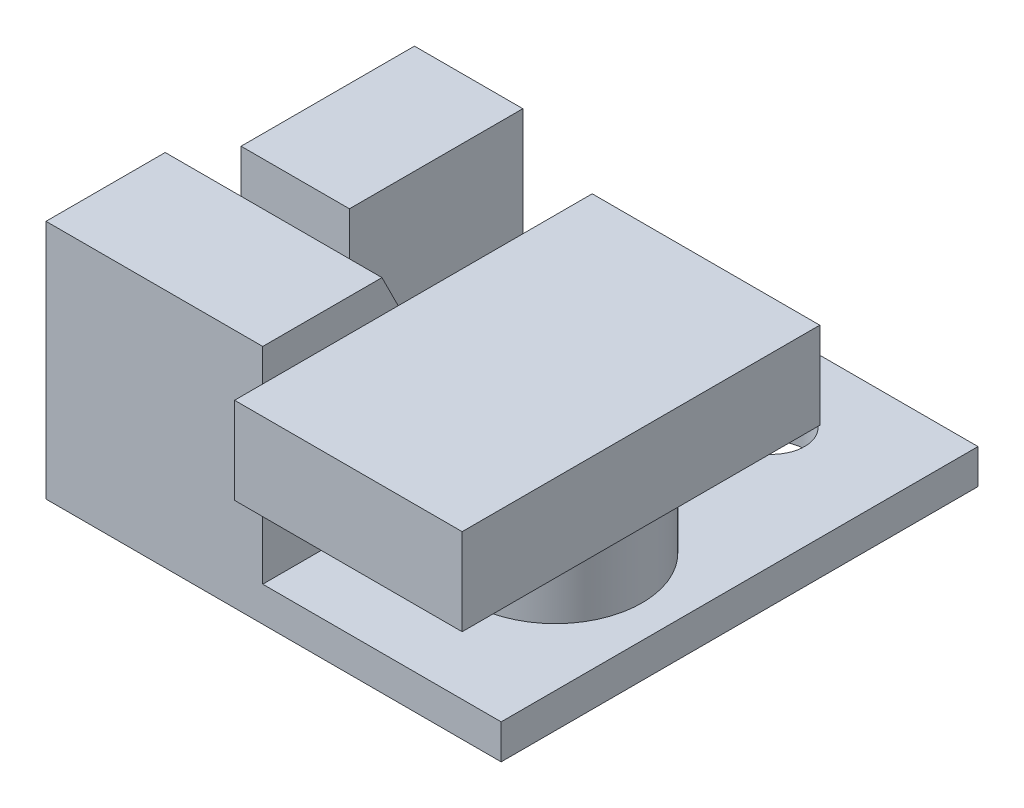
ISO-10303-21;
HEADER;
FILE_DESCRIPTION(('STEP AP214'),'2;1');
FILE_NAME('part.step','',(''),(''),'','','');
FILE_SCHEMA(('AUTOMOTIVE_DESIGN { 1 0 10303 214 1 1 1 1 }'));
ENDSEC;
DATA;
#1=APPLICATION_CONTEXT('core data for automotive mechanical design processes');
#2=APPLICATION_PROTOCOL_DEFINITION('international standard','automotive_design',2000,#1);
#3=PRODUCT_CONTEXT('',#1,'mechanical');
#4=PRODUCT('Part','Part','',(#3));
#5=PRODUCT_RELATED_PRODUCT_CATEGORY('part','',(#4));
#6=PRODUCT_DEFINITION_FORMATION('','',#4);
#7=PRODUCT_DEFINITION_CONTEXT('part definition',#1,'design');
#8=PRODUCT_DEFINITION('design','',#6,#7);
#9=PRODUCT_DEFINITION_SHAPE('','',#8);
#10=(LENGTH_UNIT() NAMED_UNIT(*) SI_UNIT(.MILLI.,.METRE.));
#11=(NAMED_UNIT(*) PLANE_ANGLE_UNIT() SI_UNIT($,.RADIAN.));
#12=(NAMED_UNIT(*) SI_UNIT($,.STERADIAN.) SOLID_ANGLE_UNIT());
#13=UNCERTAINTY_MEASURE_WITH_UNIT(LENGTH_MEASURE(1.E-05),#10,'distance_accuracy_value','');
#14=(GEOMETRIC_REPRESENTATION_CONTEXT(3) GLOBAL_UNCERTAINTY_ASSIGNED_CONTEXT((#13)) GLOBAL_UNIT_ASSIGNED_CONTEXT((#10,
#11,#12)) REPRESENTATION_CONTEXT('',''));
#15=CARTESIAN_POINT('',(0.,0.,0.));
#16=DIRECTION('',(0.,0.,1.));
#17=DIRECTION('',(1.,0.,0.));
#18=AXIS2_PLACEMENT_3D('',#15,#16,#17);
#19=CARTESIAN_POINT('',(0.,1.6,0.));
#20=DIRECTION('',(0.,1.,0.));
#21=DIRECTION('',(0.,0.,1.));
#22=AXIS2_PLACEMENT_3D('',#19,#20,#21);
#23=PLANE('',#22);
#24=DIRECTION('',(-1.,0.,0.));
#25=VECTOR('',#24,1.);
#26=CARTESIAN_POINT('',(-0.500000000000005,1.6,3.5));
#27=LINE('',#26,#25);
#28=CARTESIAN_POINT('',(-0.500000000000005,1.6,3.5));
#29=VERTEX_POINT('',#28);
#30=CARTESIAN_POINT('',(-10.5,1.6,3.5));
#31=VERTEX_POINT('',#30);
#32=EDGE_CURVE('E196',#29,#31,#27,.T.);
#33=ORIENTED_EDGE('',*,*,#32,.F.);
#34=DIRECTION('',(0.,0.,-1.));
#35=VECTOR('',#34,1.);
#36=CARTESIAN_POINT('',(-0.500000000000005,1.6,3.5));
#37=LINE('',#36,#35);
#38=CARTESIAN_POINT('',(-0.500000000000004,1.6,11.));
#39=VERTEX_POINT('',#38);
#40=EDGE_CURVE('E191',#39,#29,#37,.T.);
#41=ORIENTED_EDGE('',*,*,#40,.F.);
#42=DIRECTION('',(1.,0.,0.));
#43=VECTOR('',#42,1.);
#44=CARTESIAN_POINT('',(-10.5,1.6,11.));
#45=LINE('',#44,#43);
#46=CARTESIAN_POINT('',(10.5,1.6,11.));
#47=VERTEX_POINT('',#46);
#48=EDGE_CURVE('E274',#39,#47,#45,.T.);
#49=ORIENTED_EDGE('',*,*,#48,.T.);
#50=DIRECTION('',(0.,0.,-1.));
#51=VECTOR('',#50,1.);
#52=CARTESIAN_POINT('',(10.5,1.6,-11.));
#53=LINE('',#52,#51);
#54=CARTESIAN_POINT('',(10.5,1.6,-11.));
#55=VERTEX_POINT('',#54);
#56=EDGE_CURVE('E264',#47,#55,#53,.T.);
#57=ORIENTED_EDGE('',*,*,#56,.T.);
#58=DIRECTION('',(-1.,0.,0.));
#59=VECTOR('',#58,1.);
#60=CARTESIAN_POINT('',(-10.5,1.6,-11.));
#61=LINE('',#60,#59);
#62=CARTESIAN_POINT('',(1.5,1.6,-11.));
#63=VERTEX_POINT('',#62);
#64=EDGE_CURVE('E267',#55,#63,#61,.T.);
#65=ORIENTED_EDGE('',*,*,#64,.T.);
#66=DIRECTION('',(0.707106781186546,0.,-0.707106781186549));
#67=VECTOR('',#66,1.);
#68=CARTESIAN_POINT('',(-0.999999999999988,1.6,-8.5));
#69=LINE('',#68,#67);
#70=CARTESIAN_POINT('',(-0.999999999999988,1.6,-8.5));
#71=VERTEX_POINT('',#70);
#72=EDGE_CURVE('E252',#71,#63,#69,.T.);
#73=ORIENTED_EDGE('',*,*,#72,.F.);
#74=DIRECTION('',(1.,0.,0.));
#75=VECTOR('',#74,1.);
#76=CARTESIAN_POINT('',(-12.0780291909739,1.6,-8.5));
#77=LINE('',#76,#75);
#78=CARTESIAN_POINT('',(-10.5,1.6,-8.5));
#79=VERTEX_POINT('',#78);
#80=EDGE_CURVE('E245',#79,#71,#77,.T.);
#81=ORIENTED_EDGE('',*,*,#80,.F.);
#82=DIRECTION('',(0.,0.,1.));
#83=VECTOR('',#82,1.);
#84=CARTESIAN_POINT('',(-10.5,1.6,-11.));
#85=LINE('',#84,#83);
#86=EDGE_CURVE('E271',#79,#31,#85,.T.);
#87=ORIENTED_EDGE('',*,*,#86,.T.);
#88=EDGE_LOOP('',(#33,#41,#49,#57,#65,#73,#81,#87));
#89=FACE_BOUND('',#88,.T.);
#90=CARTESIAN_POINT('',(5.,1.6,-7.));
#91=DIRECTION('',(0.,1.,0.));
#92=DIRECTION('',(0.,0.,1.));
#93=AXIS2_PLACEMENT_3D('',#90,#91,#92);
#94=CIRCLE('',#93,1.5);
#95=CARTESIAN_POINT('',(5.,1.6,-5.5));
#96=VERTEX_POINT('',#95);
#97=EDGE_CURVE('E241',#96,#96,#94,.T.);
#98=ORIENTED_EDGE('',*,*,#97,.F.);
#99=EDGE_LOOP('',(#98));
#100=FACE_BOUND('',#99,.T.);
#101=DIRECTION('',(1.,0.,0.));
#102=VECTOR('',#101,1.);
#103=CARTESIAN_POINT('',(-5.,1.6,2.5));
#104=LINE('',#103,#102);
#105=CARTESIAN_POINT('',(-10.,1.6,2.5));
#106=VERTEX_POINT('',#105);
#107=CARTESIAN_POINT('',(-5.,1.6,2.5));
#108=VERTEX_POINT('',#107);
#109=EDGE_CURVE('E226',#106,#108,#104,.T.);
#110=ORIENTED_EDGE('',*,*,#109,.F.);
#111=DIRECTION('',(0.,0.,1.));
#112=VECTOR('',#111,1.);
#113=CARTESIAN_POINT('',(-10.,1.6,-5.5));
#114=LINE('',#113,#112);
#115=CARTESIAN_POINT('',(-10.,1.6,-5.5));
#116=VERTEX_POINT('',#115);
#117=EDGE_CURVE('E212',#116,#106,#114,.T.);
#118=ORIENTED_EDGE('',*,*,#117,.F.);
#119=DIRECTION('',(-1.,0.,0.));
#120=VECTOR('',#119,1.);
#121=CARTESIAN_POINT('',(-5.,1.6,-5.5));
#122=LINE('',#121,#120);
#123=CARTESIAN_POINT('',(-5.,1.6,-5.5));
#124=VERTEX_POINT('',#123);
#125=EDGE_CURVE('E217',#124,#116,#122,.T.);
#126=ORIENTED_EDGE('',*,*,#125,.F.);
#127=DIRECTION('',(0.,0.,-1.));
#128=VECTOR('',#127,1.);
#129=CARTESIAN_POINT('',(-5.,1.6,-5.5));
#130=LINE('',#129,#128);
#131=EDGE_CURVE('E228',#108,#124,#130,.T.);
#132=ORIENTED_EDGE('',*,*,#131,.F.);
#133=EDGE_LOOP('',(#110,#118,#126,#132));
#134=FACE_BOUND('',#133,.T.);
#135=CARTESIAN_POINT('',(5.,1.6,3.));
#136=DIRECTION('',(0.,1.,0.));
#137=DIRECTION('',(0.,0.,1.));
#138=AXIS2_PLACEMENT_3D('',#135,#136,#137);
#139=CIRCLE('',#138,4.);
#140=CARTESIAN_POINT('',(5.,1.6,7.));
#141=VERTEX_POINT('',#140);
#142=EDGE_CURVE('E181',#141,#141,#139,.T.);
#143=ORIENTED_EDGE('',*,*,#142,.F.);
#144=EDGE_LOOP('',(#143));
#145=FACE_BOUND('',#144,.T.);
#146=ADVANCED_FACE('F33',(#89,#100,#134,#145),#23,.T.);
#147=CARTESIAN_POINT('',(10.5,1.6,-11.));
#148=DIRECTION('',(-1.,0.,0.));
#149=DIRECTION('',(0.,0.,1.));
#150=AXIS2_PLACEMENT_3D('',#147,#148,#149);
#151=PLANE('',#150);
#152=DIRECTION('',(0.,0.,-1.));
#153=VECTOR('',#152,1.);
#154=CARTESIAN_POINT('',(10.5,0.,-11.));
#155=LINE('',#154,#153);
#156=CARTESIAN_POINT('',(10.5,0.,11.));
#157=VERTEX_POINT('',#156);
#158=CARTESIAN_POINT('',(10.5,0.,-11.));
#159=VERTEX_POINT('',#158);
#160=EDGE_CURVE('E263',#157,#159,#155,.T.);
#161=ORIENTED_EDGE('',*,*,#160,.T.);
#162=DIRECTION('',(0.,-1.,0.));
#163=VECTOR('',#162,1.);
#164=CARTESIAN_POINT('',(10.5,1.6,-11.));
#165=LINE('',#164,#163);
#166=EDGE_CURVE('E290',#55,#159,#165,.T.);
#167=ORIENTED_EDGE('',*,*,#166,.F.);
#168=ORIENTED_EDGE('',*,*,#56,.F.);
#169=DIRECTION('',(0.,-1.,0.));
#170=VECTOR('',#169,1.);
#171=CARTESIAN_POINT('',(10.5,1.6,11.));
#172=LINE('',#171,#170);
#173=EDGE_CURVE('E276',#47,#157,#172,.T.);
#174=ORIENTED_EDGE('',*,*,#173,.T.);
#175=EDGE_LOOP('',(#161,#167,#168,#174));
#176=FACE_BOUND('',#175,.T.);
#177=ADVANCED_FACE('F329',(#176),#151,.F.);
#178=CARTESIAN_POINT('',(-10.5,1.6,-11.));
#179=DIRECTION('',(0.,0.,1.));
#180=DIRECTION('',(1.,0.,0.));
#181=AXIS2_PLACEMENT_3D('',#178,#179,#180);
#182=PLANE('',#181);
#183=DIRECTION('',(-1.,0.,0.));
#184=VECTOR('',#183,1.);
#185=CARTESIAN_POINT('',(-10.5,0.,-11.));
#186=LINE('',#185,#184);
#187=CARTESIAN_POINT('',(1.5,0.,-11.));
#188=VERTEX_POINT('',#187);
#189=EDGE_CURVE('E279',#159,#188,#186,.T.);
#190=ORIENTED_EDGE('',*,*,#189,.T.);
#191=DIRECTION('',(0.,1.,0.));
#192=VECTOR('',#191,1.);
#193=CARTESIAN_POINT('',(1.5,0.,-11.));
#194=LINE('',#193,#192);
#195=EDGE_CURVE('E255',#188,#63,#194,.T.);
#196=ORIENTED_EDGE('',*,*,#195,.T.);
#197=ORIENTED_EDGE('',*,*,#64,.F.);
#198=ORIENTED_EDGE('',*,*,#166,.T.);
#199=EDGE_LOOP('',(#190,#196,#197,#198));
#200=FACE_BOUND('',#199,.T.);
#201=ADVANCED_FACE('F335',(#200),#182,.F.);
#202=CARTESIAN_POINT('',(-10.5,1.6,-11.));
#203=DIRECTION('',(1.,0.,0.));
#204=DIRECTION('',(0.,0.,-1.));
#205=AXIS2_PLACEMENT_3D('',#202,#203,#204);
#206=PLANE('',#205);
#207=DIRECTION('',(0.,0.,1.));
#208=VECTOR('',#207,1.);
#209=CARTESIAN_POINT('',(-10.5,11.1,3.5));
#210=LINE('',#209,#208);
#211=CARTESIAN_POINT('',(-10.5,11.1,5.5));
#212=VERTEX_POINT('',#211);
#213=CARTESIAN_POINT('',(-10.5,11.1,11.));
#214=VERTEX_POINT('',#213);
#215=EDGE_CURVE('E193',#212,#214,#210,.T.);
#216=ORIENTED_EDGE('',*,*,#215,.F.);
#217=DIRECTION('',(0.,0.894427190999917,0.447213595499956));
#218=VECTOR('',#217,1.);
#219=CARTESIAN_POINT('',(-10.5,11.1,5.5));
#220=LINE('',#219,#218);
#221=CARTESIAN_POINT('',(-10.5,7.09999999999997,3.5));
#222=VERTEX_POINT('',#221);
#223=EDGE_CURVE('E55',#212,#222,#220,.F.);
#224=ORIENTED_EDGE('',*,*,#223,.T.);
#225=DIRECTION('',(0.,-1.,0.));
#226=VECTOR('',#225,1.);
#227=CARTESIAN_POINT('',(-10.5,11.1,3.5));
#228=LINE('',#227,#226);
#229=EDGE_CURVE('E201',#222,#31,#228,.T.);
#230=ORIENTED_EDGE('',*,*,#229,.T.);
#231=ORIENTED_EDGE('',*,*,#86,.F.);
#232=DIRECTION('',(0.,-1.,0.));
#233=VECTOR('',#232,1.);
#234=CARTESIAN_POINT('',(-10.5,1.6,-8.5));
#235=LINE('',#234,#233);
#236=CARTESIAN_POINT('',(-10.5,0.,-8.5));
#237=VERTEX_POINT('',#236);
#238=EDGE_CURVE('E258',#79,#237,#235,.T.);
#239=ORIENTED_EDGE('',*,*,#238,.T.);
#240=DIRECTION('',(0.,0.,1.));
#241=VECTOR('',#240,1.);
#242=CARTESIAN_POINT('',(-10.5,0.,-11.));
#243=LINE('',#242,#241);
#244=CARTESIAN_POINT('',(-10.5,0.,11.));
#245=VERTEX_POINT('',#244);
#246=EDGE_CURVE('E282',#237,#245,#243,.T.);
#247=ORIENTED_EDGE('',*,*,#246,.T.);
#248=DIRECTION('',(0.,-1.,0.));
#249=VECTOR('',#248,1.);
#250=CARTESIAN_POINT('',(-10.5,1.6,11.));
#251=LINE('',#250,#249);
#252=EDGE_CURVE('E287',#214,#245,#251,.T.);
#253=ORIENTED_EDGE('',*,*,#252,.F.);
#254=EDGE_LOOP('',(#216,#224,#230,#231,#239,#247,#253));
#255=FACE_BOUND('',#254,.T.);
#256=ADVANCED_FACE('F306',(#255),#206,.F.);
#257=CARTESIAN_POINT('',(-10.5,1.6,11.));
#258=DIRECTION('',(0.,0.,-1.));
#259=DIRECTION('',(-1.,0.,0.));
#260=AXIS2_PLACEMENT_3D('',#257,#258,#259);
#261=PLANE('',#260);
#262=DIRECTION('',(1.,0.,0.));
#263=VECTOR('',#262,1.);
#264=CARTESIAN_POINT('',(-10.5,0.,11.));
#265=LINE('',#264,#263);
#266=EDGE_CURVE('E268',#245,#157,#265,.T.);
#267=ORIENTED_EDGE('',*,*,#266,.T.);
#268=ORIENTED_EDGE('',*,*,#173,.F.);
#269=ORIENTED_EDGE('',*,*,#48,.F.);
#270=DIRECTION('',(0.,-1.,0.));
#271=VECTOR('',#270,1.);
#272=CARTESIAN_POINT('',(-0.500000000000004,11.1,11.));
#273=LINE('',#272,#271);
#274=CARTESIAN_POINT('',(-0.500000000000004,11.1,11.));
#275=VERTEX_POINT('',#274);
#276=EDGE_CURVE('E209',#275,#39,#273,.T.);
#277=ORIENTED_EDGE('',*,*,#276,.F.);
#278=DIRECTION('',(1.,0.,0.));
#279=VECTOR('',#278,1.);
#280=CARTESIAN_POINT('',(-0.500000000000004,11.1,11.));
#281=LINE('',#280,#279);
#282=EDGE_CURVE('E195',#214,#275,#281,.T.);
#283=ORIENTED_EDGE('',*,*,#282,.F.);
#284=ORIENTED_EDGE('',*,*,#252,.T.);
#285=EDGE_LOOP('',(#267,#268,#269,#277,#283,#284));
#286=FACE_BOUND('',#285,.T.);
#287=ADVANCED_FACE('F312',(#286),#261,.F.);
#288=CARTESIAN_POINT('',(0.,0.,0.));
#289=DIRECTION('',(0.,1.,0.));
#290=DIRECTION('',(0.,0.,1.));
#291=AXIS2_PLACEMENT_3D('',#288,#289,#290);
#292=PLANE('',#291);
#293=CARTESIAN_POINT('',(5.,0.,-7.));
#294=DIRECTION('',(0.,1.,0.));
#295=DIRECTION('',(0.,0.,1.));
#296=AXIS2_PLACEMENT_3D('',#293,#294,#295);
#297=CIRCLE('',#296,1.5);
#298=CARTESIAN_POINT('',(5.,0.,-5.5));
#299=VERTEX_POINT('',#298);
#300=EDGE_CURVE('E242',#299,#299,#297,.T.);
#301=ORIENTED_EDGE('',*,*,#300,.T.);
#302=EDGE_LOOP('',(#301));
#303=FACE_BOUND('',#302,.T.);
#304=DIRECTION('',(1.,0.,0.));
#305=VECTOR('',#304,1.);
#306=CARTESIAN_POINT('',(0.,0.,-8.5));
#307=LINE('',#306,#305);
#308=CARTESIAN_POINT('',(-0.999999999999988,0.,-8.5));
#309=VERTEX_POINT('',#308);
#310=EDGE_CURVE('E293',#237,#309,#307,.T.);
#311=ORIENTED_EDGE('',*,*,#310,.T.);
#312=DIRECTION('',(0.707106781186546,0.,-0.707106781186549));
#313=VECTOR('',#312,1.);
#314=CARTESIAN_POINT('',(-0.999999999999988,0.,-8.5));
#315=LINE('',#314,#313);
#316=EDGE_CURVE('E248',#309,#188,#315,.T.);
#317=ORIENTED_EDGE('',*,*,#316,.T.);
#318=ORIENTED_EDGE('',*,*,#189,.F.);
#319=ORIENTED_EDGE('',*,*,#160,.F.);
#320=ORIENTED_EDGE('',*,*,#266,.F.);
#321=ORIENTED_EDGE('',*,*,#246,.F.);
#322=EDGE_LOOP('',(#311,#317,#318,#319,#320,#321));
#323=FACE_BOUND('',#322,.T.);
#324=ADVANCED_FACE('F343',(#303,#323),#292,.F.);
#325=CARTESIAN_POINT('',(-12.0780291909739,0.,-8.5));
#326=DIRECTION('',(0.,0.,1.));
#327=DIRECTION('',(1.,0.,0.));
#328=AXIS2_PLACEMENT_3D('',#325,#326,#327);
#329=PLANE('',#328);
#330=ORIENTED_EDGE('',*,*,#80,.T.);
#331=DIRECTION('',(0.,1.,0.));
#332=VECTOR('',#331,1.);
#333=CARTESIAN_POINT('',(-0.999999999999988,0.,-8.5));
#334=LINE('',#333,#332);
#335=EDGE_CURVE('E251',#309,#71,#334,.T.);
#336=ORIENTED_EDGE('',*,*,#335,.F.);
#337=ORIENTED_EDGE('',*,*,#310,.F.);
#338=ORIENTED_EDGE('',*,*,#238,.F.);
#339=EDGE_LOOP('',(#330,#336,#337,#338));
#340=FACE_BOUND('',#339,.T.);
#341=ADVANCED_FACE('F341',(#340),#329,.F.);
#342=CARTESIAN_POINT('',(-0.999999999999988,0.,-8.5));
#343=DIRECTION('',(0.707106781186549,0.,0.707106781186546));
#344=DIRECTION('',(0.707106781186546,0.,-0.707106781186549));
#345=AXIS2_PLACEMENT_3D('',#342,#343,#344);
#346=PLANE('',#345);
#347=ORIENTED_EDGE('',*,*,#72,.T.);
#348=ORIENTED_EDGE('',*,*,#195,.F.);
#349=ORIENTED_EDGE('',*,*,#316,.F.);
#350=ORIENTED_EDGE('',*,*,#335,.T.);
#351=EDGE_LOOP('',(#347,#348,#349,#350));
#352=FACE_BOUND('',#351,.T.);
#353=ADVANCED_FACE('F360',(#352),#346,.F.);
#354=CARTESIAN_POINT('',(5.,0.,-7.));
#355=DIRECTION('',(0.,1.,0.));
#356=DIRECTION('',(0.,0.,1.));
#357=AXIS2_PLACEMENT_3D('',#354,#355,#356);
#358=CYLINDRICAL_SURFACE('',#357,1.5);
#359=ORIENTED_EDGE('',*,*,#300,.F.);
#360=EDGE_LOOP('',(#359));
#361=FACE_BOUND('',#360,.T.);
#362=ORIENTED_EDGE('',*,*,#97,.T.);
#363=EDGE_LOOP('',(#362));
#364=FACE_BOUND('',#363,.T.);
#365=ADVANCED_FACE('F392',(#361,#364),#358,.F.);
#366=CARTESIAN_POINT('',(-10.,10.1,-5.5));
#367=DIRECTION('',(1.,0.,0.));
#368=DIRECTION('',(0.,0.,-1.));
#369=AXIS2_PLACEMENT_3D('',#366,#367,#368);
#370=PLANE('',#369);
#371=ORIENTED_EDGE('',*,*,#117,.T.);
#372=DIRECTION('',(0.,-1.,0.));
#373=VECTOR('',#372,1.);
#374=CARTESIAN_POINT('',(-10.,10.1,2.5));
#375=LINE('',#374,#373);
#376=CARTESIAN_POINT('',(-10.,10.1,2.5));
#377=VERTEX_POINT('',#376);
#378=EDGE_CURVE('E239',#377,#106,#375,.T.);
#379=ORIENTED_EDGE('',*,*,#378,.F.);
#380=DIRECTION('',(0.,0.,1.));
#381=VECTOR('',#380,1.);
#382=CARTESIAN_POINT('',(-10.,10.1,-5.5));
#383=LINE('',#382,#381);
#384=CARTESIAN_POINT('',(-10.,10.1,-5.5));
#385=VERTEX_POINT('',#384);
#386=EDGE_CURVE('E213',#385,#377,#383,.T.);
#387=ORIENTED_EDGE('',*,*,#386,.F.);
#388=DIRECTION('',(0.,-1.,0.));
#389=VECTOR('',#388,1.);
#390=CARTESIAN_POINT('',(-10.,10.1,-5.5));
#391=LINE('',#390,#389);
#392=EDGE_CURVE('E223',#385,#116,#391,.T.);
#393=ORIENTED_EDGE('',*,*,#392,.T.);
#394=EDGE_LOOP('',(#371,#379,#387,#393));
#395=FACE_BOUND('',#394,.T.);
#396=ADVANCED_FACE('F388',(#395),#370,.F.);
#397=CARTESIAN_POINT('',(-5.,10.1,2.5));
#398=DIRECTION('',(0.,0.,-1.));
#399=DIRECTION('',(-1.,0.,0.));
#400=AXIS2_PLACEMENT_3D('',#397,#398,#399);
#401=PLANE('',#400);
#402=ORIENTED_EDGE('',*,*,#109,.T.);
#403=DIRECTION('',(0.,-1.,0.));
#404=VECTOR('',#403,1.);
#405=CARTESIAN_POINT('',(-5.,10.1,2.5));
#406=LINE('',#405,#404);
#407=CARTESIAN_POINT('',(-5.,10.1,2.5));
#408=VERTEX_POINT('',#407);
#409=EDGE_CURVE('E236',#408,#108,#406,.T.);
#410=ORIENTED_EDGE('',*,*,#409,.F.);
#411=DIRECTION('',(1.,0.,0.));
#412=VECTOR('',#411,1.);
#413=CARTESIAN_POINT('',(-5.,10.1,2.5));
#414=LINE('',#413,#412);
#415=EDGE_CURVE('E216',#377,#408,#414,.T.);
#416=ORIENTED_EDGE('',*,*,#415,.F.);
#417=ORIENTED_EDGE('',*,*,#378,.T.);
#418=EDGE_LOOP('',(#402,#410,#416,#417));
#419=FACE_BOUND('',#418,.T.);
#420=ADVANCED_FACE('F384',(#419),#401,.F.);
#421=CARTESIAN_POINT('',(-5.,10.1,-5.5));
#422=DIRECTION('',(-1.,0.,0.));
#423=DIRECTION('',(0.,0.,1.));
#424=AXIS2_PLACEMENT_3D('',#421,#422,#423);
#425=PLANE('',#424);
#426=ORIENTED_EDGE('',*,*,#131,.T.);
#427=DIRECTION('',(0.,-1.,0.));
#428=VECTOR('',#427,1.);
#429=CARTESIAN_POINT('',(-5.,10.1,-5.5));
#430=LINE('',#429,#428);
#431=CARTESIAN_POINT('',(-5.,10.1,-5.5));
#432=VERTEX_POINT('',#431);
#433=EDGE_CURVE('E234',#432,#124,#430,.T.);
#434=ORIENTED_EDGE('',*,*,#433,.F.);
#435=DIRECTION('',(0.,0.,-1.));
#436=VECTOR('',#435,1.);
#437=CARTESIAN_POINT('',(-5.,10.1,-5.5));
#438=LINE('',#437,#436);
#439=EDGE_CURVE('E219',#408,#432,#438,.T.);
#440=ORIENTED_EDGE('',*,*,#439,.F.);
#441=ORIENTED_EDGE('',*,*,#409,.T.);
#442=EDGE_LOOP('',(#426,#434,#440,#441));
#443=FACE_BOUND('',#442,.T.);
#444=ADVANCED_FACE('F380',(#443),#425,.F.);
#445=CARTESIAN_POINT('',(-5.,10.1,-5.5));
#446=DIRECTION('',(0.,0.,1.));
#447=DIRECTION('',(1.,0.,0.));
#448=AXIS2_PLACEMENT_3D('',#445,#446,#447);
#449=PLANE('',#448);
#450=ORIENTED_EDGE('',*,*,#125,.T.);
#451=ORIENTED_EDGE('',*,*,#392,.F.);
#452=DIRECTION('',(-1.,0.,0.));
#453=VECTOR('',#452,1.);
#454=CARTESIAN_POINT('',(-5.,10.1,-5.5));
#455=LINE('',#454,#453);
#456=EDGE_CURVE('E221',#432,#385,#455,.T.);
#457=ORIENTED_EDGE('',*,*,#456,.F.);
#458=ORIENTED_EDGE('',*,*,#433,.T.);
#459=EDGE_LOOP('',(#450,#451,#457,#458));
#460=FACE_BOUND('',#459,.T.);
#461=ADVANCED_FACE('F376',(#460),#449,.F.);
#462=CARTESIAN_POINT('',(0.,10.1,0.));
#463=DIRECTION('',(0.,-1.,0.));
#464=DIRECTION('',(0.,0.,-1.));
#465=AXIS2_PLACEMENT_3D('',#462,#463,#464);
#466=PLANE('',#465);
#467=ORIENTED_EDGE('',*,*,#386,.T.);
#468=ORIENTED_EDGE('',*,*,#415,.T.);
#469=ORIENTED_EDGE('',*,*,#439,.T.);
#470=ORIENTED_EDGE('',*,*,#456,.T.);
#471=EDGE_LOOP('',(#467,#468,#469,#470));
#472=FACE_BOUND('',#471,.T.);
#473=ADVANCED_FACE('F371',(#472),#466,.F.);
#474=CARTESIAN_POINT('',(-0.500000000000005,11.1,3.5));
#475=DIRECTION('',(-1.,0.,0.));
#476=DIRECTION('',(0.,0.,1.));
#477=AXIS2_PLACEMENT_3D('',#474,#475,#476);
#478=PLANE('',#477);
#479=DIRECTION('',(0.,-1.,0.));
#480=VECTOR('',#479,1.);
#481=CARTESIAN_POINT('',(-0.500000000000005,11.1,3.5));
#482=LINE('',#481,#480);
#483=CARTESIAN_POINT('',(-0.500000000000005,7.09999999999997,3.5));
#484=VERTEX_POINT('',#483);
#485=EDGE_CURVE('E207',#484,#29,#482,.T.);
#486=ORIENTED_EDGE('',*,*,#485,.F.);
#487=DIRECTION('',(0.,-0.894427190999917,-0.447213595499956));
#488=VECTOR('',#487,1.);
#489=CARTESIAN_POINT('',(-0.500000000000005,11.1,5.5));
#490=LINE('',#489,#488);
#491=CARTESIAN_POINT('',(-0.500000000000005,11.1,5.5));
#492=VERTEX_POINT('',#491);
#493=EDGE_CURVE('E11',#484,#492,#490,.F.);
#494=ORIENTED_EDGE('',*,*,#493,.T.);
#495=DIRECTION('',(0.,0.,-1.));
#496=VECTOR('',#495,1.);
#497=CARTESIAN_POINT('',(-0.500000000000005,11.1,3.5));
#498=LINE('',#497,#496);
#499=EDGE_CURVE('E198',#275,#492,#498,.T.);
#500=ORIENTED_EDGE('',*,*,#499,.F.);
#501=ORIENTED_EDGE('',*,*,#276,.T.);
#502=ORIENTED_EDGE('',*,*,#40,.T.);
#503=EDGE_LOOP('',(#486,#494,#500,#501,#502));
#504=FACE_BOUND('',#503,.T.);
#505=ADVANCED_FACE('F316',(#504),#478,.F.);
#506=CARTESIAN_POINT('',(-0.500000000000005,11.1,3.5));
#507=DIRECTION('',(0.,0.,1.));
#508=DIRECTION('',(1.,0.,0.));
#509=AXIS2_PLACEMENT_3D('',#506,#507,#508);
#510=PLANE('',#509);
#511=ORIENTED_EDGE('',*,*,#229,.F.);
#512=DIRECTION('',(1.,0.,0.));
#513=VECTOR('',#512,1.);
#514=CARTESIAN_POINT('',(-0.500000000000005,7.09999999999997,3.5));
#515=LINE('',#514,#513);
#516=EDGE_CURVE('E41',#222,#484,#515,.T.);
#517=ORIENTED_EDGE('',*,*,#516,.T.);
#518=ORIENTED_EDGE('',*,*,#485,.T.);
#519=ORIENTED_EDGE('',*,*,#32,.T.);
#520=EDGE_LOOP('',(#511,#517,#518,#519));
#521=FACE_BOUND('',#520,.T.);
#522=ADVANCED_FACE('F326',(#521),#510,.F.);
#523=CARTESIAN_POINT('',(0.,11.1,0.));
#524=DIRECTION('',(0.,-1.,0.));
#525=DIRECTION('',(0.,0.,-1.));
#526=AXIS2_PLACEMENT_3D('',#523,#524,#525);
#527=PLANE('',#526);
#528=ORIENTED_EDGE('',*,*,#499,.T.);
#529=DIRECTION('',(-1.,0.,0.));
#530=VECTOR('',#529,1.);
#531=CARTESIAN_POINT('',(0.,11.1,5.5));
#532=LINE('',#531,#530);
#533=EDGE_CURVE('E296',#492,#212,#532,.T.);
#534=ORIENTED_EDGE('',*,*,#533,.T.);
#535=ORIENTED_EDGE('',*,*,#215,.T.);
#536=ORIENTED_EDGE('',*,*,#282,.T.);
#537=EDGE_LOOP('',(#528,#534,#535,#536));
#538=FACE_BOUND('',#537,.T.);
#539=ADVANCED_FACE('F301',(#538),#527,.F.);
#540=CARTESIAN_POINT('',(0.,11.1,5.5));
#541=DIRECTION('',(0.,-0.447213595499956,0.894427190999917));
#542=DIRECTION('',(-1.,0.,0.));
#543=AXIS2_PLACEMENT_3D('',#540,#541,#542);
#544=PLANE('',#543);
#545=ORIENTED_EDGE('',*,*,#493,.F.);
#546=ORIENTED_EDGE('',*,*,#516,.F.);
#547=ORIENTED_EDGE('',*,*,#223,.F.);
#548=ORIENTED_EDGE('',*,*,#533,.F.);
#549=EDGE_LOOP('',(#545,#546,#547,#548));
#550=FACE_BOUND('',#549,.T.);
#551=ADVANCED_FACE('F35',(#550),#544,.F.);
#552=CARTESIAN_POINT('',(5.,6.1,3.));
#553=DIRECTION('',(0.,-1.,0.));
#554=DIRECTION('',(0.,0.,-1.));
#555=AXIS2_PLACEMENT_3D('',#552,#553,#554);
#556=CYLINDRICAL_SURFACE('',#555,4.);
#557=CARTESIAN_POINT('',(5.,6.1,3.));
#558=DIRECTION('',(0.,1.,0.));
#559=DIRECTION('',(0.,0.,1.));
#560=AXIS2_PLACEMENT_3D('',#557,#558,#559);
#561=CIRCLE('',#560,4.);
#562=CARTESIAN_POINT('',(5.,6.1,7.));
#563=VERTEX_POINT('',#562);
#564=EDGE_CURVE('E184',#563,#563,#561,.T.);
#565=ORIENTED_EDGE('',*,*,#564,.F.);
#566=EDGE_LOOP('',(#565));
#567=FACE_BOUND('',#566,.T.);
#568=ORIENTED_EDGE('',*,*,#142,.T.);
#569=EDGE_LOOP('',(#568));
#570=FACE_BOUND('',#569,.T.);
#571=ADVANCED_FACE('F318',(#567,#570),#556,.T.);
#572=CARTESIAN_POINT('',(0.,6.1,0.));
#573=DIRECTION('',(0.,1.,0.));
#574=DIRECTION('',(0.,0.,1.));
#575=AXIS2_PLACEMENT_3D('',#572,#573,#574);
#576=PLANE('',#575);
#577=DIRECTION('',(0.,0.,-1.));
#578=VECTOR('',#577,1.);
#579=CARTESIAN_POINT('',(10.5,6.1,-3.70000000000001));
#580=LINE('',#579,#578);
#581=CARTESIAN_POINT('',(10.5,6.1,12.8));
#582=VERTEX_POINT('',#581);
#583=CARTESIAN_POINT('',(10.5,6.1,-3.70000000000001));
#584=VERTEX_POINT('',#583);
#585=EDGE_CURVE('E180',#582,#584,#580,.T.);
#586=ORIENTED_EDGE('',*,*,#585,.F.);
#587=DIRECTION('',(1.,0.,0.));
#588=VECTOR('',#587,1.);
#589=CARTESIAN_POINT('',(0.,6.1,12.8));
#590=LINE('',#589,#588);
#591=CARTESIAN_POINT('',(0.,6.1,12.8));
#592=VERTEX_POINT('',#591);
#593=EDGE_CURVE('E176',#592,#582,#590,.T.);
#594=ORIENTED_EDGE('',*,*,#593,.F.);
#595=DIRECTION('',(0.,0.,1.));
#596=VECTOR('',#595,1.);
#597=CARTESIAN_POINT('',(0.,6.1,-3.70000000000001));
#598=LINE('',#597,#596);
#599=CARTESIAN_POINT('',(0.,6.1,-3.70000000000001));
#600=VERTEX_POINT('',#599);
#601=EDGE_CURVE('E509',#600,#592,#598,.T.);
#602=ORIENTED_EDGE('',*,*,#601,.F.);
#603=DIRECTION('',(-1.,0.,0.));
#604=VECTOR('',#603,1.);
#605=CARTESIAN_POINT('',(0.,6.1,-3.70000000000001));
#606=LINE('',#605,#604);
#607=EDGE_CURVE('E513',#584,#600,#606,.T.);
#608=ORIENTED_EDGE('',*,*,#607,.F.);
#609=EDGE_LOOP('',(#586,#594,#602,#608));
#610=FACE_BOUND('',#609,.T.);
#611=ORIENTED_EDGE('',*,*,#564,.T.);
#612=EDGE_LOOP('',(#611));
#613=FACE_BOUND('',#612,.T.);
#614=ADVANCED_FACE('F323',(#610,#613),#576,.F.);
#615=CARTESIAN_POINT('',(10.5,10.1,-3.70000000000001));
#616=DIRECTION('',(-1.,0.,0.));
#617=DIRECTION('',(0.,0.,1.));
#618=AXIS2_PLACEMENT_3D('',#615,#616,#617);
#619=PLANE('',#618);
#620=ORIENTED_EDGE('',*,*,#585,.T.);
#621=DIRECTION('',(0.,-1.,0.));
#622=VECTOR('',#621,1.);
#623=CARTESIAN_POINT('',(10.5,10.1,-3.70000000000001));
#624=LINE('',#623,#622);
#625=CARTESIAN_POINT('',(10.5,10.1,-3.70000000000001));
#626=VERTEX_POINT('',#625);
#627=EDGE_CURVE('E160',#626,#584,#624,.T.);
#628=ORIENTED_EDGE('',*,*,#627,.F.);
#629=DIRECTION('',(0.,0.,-1.));
#630=VECTOR('',#629,1.);
#631=CARTESIAN_POINT('',(10.5,10.1,-3.70000000000001));
#632=LINE('',#631,#630);
#633=CARTESIAN_POINT('',(10.5,10.1,12.8));
#634=VERTEX_POINT('',#633);
#635=EDGE_CURVE('E167',#634,#626,#632,.T.);
#636=ORIENTED_EDGE('',*,*,#635,.F.);
#637=DIRECTION('',(0.,-1.,0.));
#638=VECTOR('',#637,1.);
#639=CARTESIAN_POINT('',(10.5,10.1,12.8));
#640=LINE('',#639,#638);
#641=EDGE_CURVE('E506',#634,#582,#640,.T.);
#642=ORIENTED_EDGE('',*,*,#641,.T.);
#643=EDGE_LOOP('',(#620,#628,#636,#642));
#644=FACE_BOUND('',#643,.T.);
#645=ADVANCED_FACE('F178',(#644),#619,.F.);
#646=CARTESIAN_POINT('',(0.,10.1,-3.70000000000001));
#647=DIRECTION('',(0.,0.,1.));
#648=DIRECTION('',(1.,0.,0.));
#649=AXIS2_PLACEMENT_3D('',#646,#647,#648);
#650=PLANE('',#649);
#651=ORIENTED_EDGE('',*,*,#607,.T.);
#652=DIRECTION('',(0.,-1.,0.));
#653=VECTOR('',#652,1.);
#654=CARTESIAN_POINT('',(0.,10.1,-3.70000000000001));
#655=LINE('',#654,#653);
#656=CARTESIAN_POINT('',(0.,10.1,-3.70000000000001));
#657=VERTEX_POINT('',#656);
#658=EDGE_CURVE('E163',#657,#600,#655,.T.);
#659=ORIENTED_EDGE('',*,*,#658,.F.);
#660=DIRECTION('',(-1.,0.,0.));
#661=VECTOR('',#660,1.);
#662=CARTESIAN_POINT('',(0.,10.1,-3.70000000000001));
#663=LINE('',#662,#661);
#664=EDGE_CURVE('E156',#626,#657,#663,.T.);
#665=ORIENTED_EDGE('',*,*,#664,.F.);
#666=ORIENTED_EDGE('',*,*,#627,.T.);
#667=EDGE_LOOP('',(#651,#659,#665,#666));
#668=FACE_BOUND('',#667,.T.);
#669=ADVANCED_FACE('F158',(#668),#650,.F.);
#670=CARTESIAN_POINT('',(0.,10.1,-3.70000000000001));
#671=DIRECTION('',(1.,0.,0.));
#672=DIRECTION('',(0.,0.,-1.));
#673=AXIS2_PLACEMENT_3D('',#670,#671,#672);
#674=PLANE('',#673);
#675=ORIENTED_EDGE('',*,*,#601,.T.);
#676=DIRECTION('',(0.,-1.,0.));
#677=VECTOR('',#676,1.);
#678=CARTESIAN_POINT('',(0.,10.1,12.8));
#679=LINE('',#678,#677);
#680=CARTESIAN_POINT('',(0.,10.1,12.8));
#681=VERTEX_POINT('',#680);
#682=EDGE_CURVE('E186',#681,#592,#679,.T.);
#683=ORIENTED_EDGE('',*,*,#682,.F.);
#684=DIRECTION('',(0.,0.,1.));
#685=VECTOR('',#684,1.);
#686=CARTESIAN_POINT('',(0.,10.1,-3.70000000000001));
#687=LINE('',#686,#685);
#688=EDGE_CURVE('E166',#657,#681,#687,.T.);
#689=ORIENTED_EDGE('',*,*,#688,.F.);
#690=ORIENTED_EDGE('',*,*,#658,.T.);
#691=EDGE_LOOP('',(#675,#683,#689,#690));
#692=FACE_BOUND('',#691,.T.);
#693=ADVANCED_FACE('F473',(#692),#674,.F.);
#694=CARTESIAN_POINT('',(0.,10.1,12.8));
#695=DIRECTION('',(0.,0.,-1.));
#696=DIRECTION('',(-1.,0.,0.));
#697=AXIS2_PLACEMENT_3D('',#694,#695,#696);
#698=PLANE('',#697);
#699=ORIENTED_EDGE('',*,*,#593,.T.);
#700=ORIENTED_EDGE('',*,*,#641,.F.);
#701=DIRECTION('',(1.,0.,0.));
#702=VECTOR('',#701,1.);
#703=CARTESIAN_POINT('',(0.,10.1,12.8));
#704=LINE('',#703,#702);
#705=EDGE_CURVE('E172',#681,#634,#704,.T.);
#706=ORIENTED_EDGE('',*,*,#705,.F.);
#707=ORIENTED_EDGE('',*,*,#682,.T.);
#708=EDGE_LOOP('',(#699,#700,#706,#707));
#709=FACE_BOUND('',#708,.T.);
#710=ADVANCED_FACE('F482',(#709),#698,.F.);
#711=CARTESIAN_POINT('',(0.,10.1,0.));
#712=DIRECTION('',(0.,1.,0.));
#713=DIRECTION('',(0.,0.,1.));
#714=AXIS2_PLACEMENT_3D('',#711,#712,#713);
#715=PLANE('',#714);
#716=ORIENTED_EDGE('',*,*,#635,.T.);
#717=ORIENTED_EDGE('',*,*,#664,.T.);
#718=ORIENTED_EDGE('',*,*,#688,.T.);
#719=ORIENTED_EDGE('',*,*,#705,.T.);
#720=EDGE_LOOP('',(#716,#717,#718,#719));
#721=FACE_BOUND('',#720,.T.);
#722=ADVANCED_FACE('F170',(#721),#715,.T.);
#723=CLOSED_SHELL('',(#146,#177,#201,#256,#287,#324,#341,#353,#365,#396,#420,#444,#461,#473,
#505,#522,#539,#551,#571,#614,#645,#669,#693,#710,#722));
#724=MANIFOLD_SOLID_BREP('B2',#723);
#725=ADVANCED_BREP_SHAPE_REPRESENTATION('',(#18,#724),#14);
#726=SHAPE_DEFINITION_REPRESENTATION(#9,#725);
ENDSEC;
END-ISO-10303-21;
